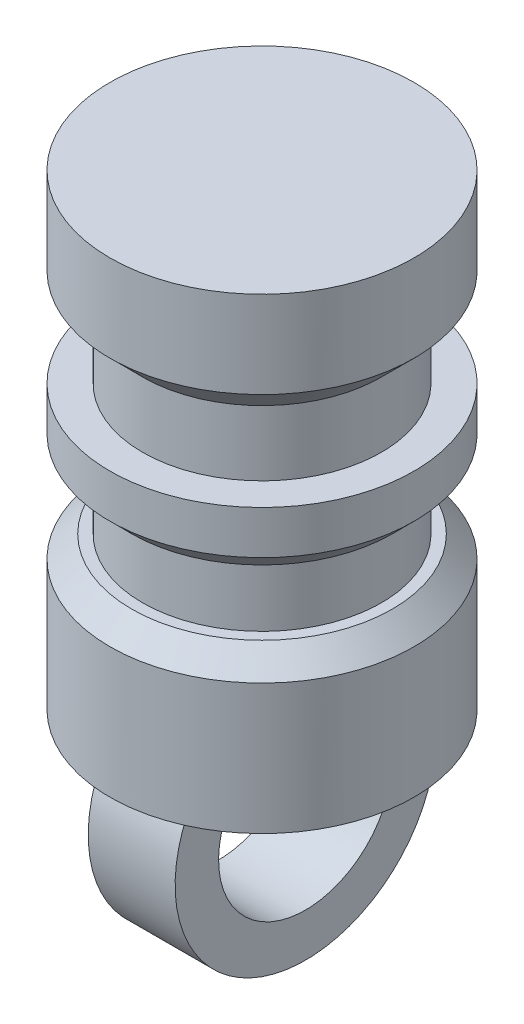
ISO-10303-21;
HEADER;
FILE_DESCRIPTION(('STEP AP214'),'2;1');
FILE_NAME('part.step','',(''),(''),'','','');
FILE_SCHEMA(('AUTOMOTIVE_DESIGN { 1 0 10303 214 1 1 1 1 }'));
ENDSEC;
DATA;
#1=APPLICATION_CONTEXT('core data for automotive mechanical design processes');
#2=APPLICATION_PROTOCOL_DEFINITION('international standard','automotive_design',2000,#1);
#3=PRODUCT_CONTEXT('',#1,'mechanical');
#4=PRODUCT('Part','Part','',(#3));
#5=PRODUCT_RELATED_PRODUCT_CATEGORY('part','',(#4));
#6=PRODUCT_DEFINITION_FORMATION('','',#4);
#7=PRODUCT_DEFINITION_CONTEXT('part definition',#1,'design');
#8=PRODUCT_DEFINITION('design','',#6,#7);
#9=PRODUCT_DEFINITION_SHAPE('','',#8);
#10=(LENGTH_UNIT() NAMED_UNIT(*) SI_UNIT(.MILLI.,.METRE.));
#11=(NAMED_UNIT(*) PLANE_ANGLE_UNIT() SI_UNIT($,.RADIAN.));
#12=(NAMED_UNIT(*) SI_UNIT($,.STERADIAN.) SOLID_ANGLE_UNIT());
#13=UNCERTAINTY_MEASURE_WITH_UNIT(LENGTH_MEASURE(1.E-05),#10,'distance_accuracy_value','');
#14=(GEOMETRIC_REPRESENTATION_CONTEXT(3) GLOBAL_UNCERTAINTY_ASSIGNED_CONTEXT((#13)) GLOBAL_UNIT_ASSIGNED_CONTEXT((#10,
#11,#12)) REPRESENTATION_CONTEXT('',''));
#15=CARTESIAN_POINT('',(0.,0.,0.));
#16=DIRECTION('',(0.,0.,1.));
#17=DIRECTION('',(1.,0.,0.));
#18=AXIS2_PLACEMENT_3D('',#15,#16,#17);
#19=CARTESIAN_POINT('',(0.,7.,0.));
#20=DIRECTION('',(0.,-1.,0.));
#21=DIRECTION('',(0.,0.,-1.));
#22=AXIS2_PLACEMENT_3D('',#19,#20,#21);
#23=CYLINDRICAL_SURFACE('',#22,7.);
#24=CARTESIAN_POINT('',(0.,11.,0.));
#25=DIRECTION('',(0.,1.,0.));
#26=DIRECTION('',(0.,0.,1.));
#27=AXIS2_PLACEMENT_3D('',#24,#25,#26);
#28=CIRCLE('',#27,7.);
#29=CARTESIAN_POINT('',(0.,11.,7.));
#30=VERTEX_POINT('',#29);
#31=EDGE_CURVE('E138',#30,#30,#28,.F.);
#32=ORIENTED_EDGE('',*,*,#31,.T.);
#33=EDGE_LOOP('',(#32));
#34=FACE_BOUND('',#33,.T.);
#35=CARTESIAN_POINT('',(0.,5.,0.));
#36=DIRECTION('',(0.,-1.,0.));
#37=DIRECTION('',(0.,0.,-1.));
#38=AXIS2_PLACEMENT_3D('',#35,#36,#37);
#39=CIRCLE('',#38,7.);
#40=CARTESIAN_POINT('',(0.,5.,-7.));
#41=VERTEX_POINT('',#40);
#42=EDGE_CURVE('E106',#41,#41,#39,.T.);
#43=ORIENTED_EDGE('',*,*,#42,.F.);
#44=EDGE_LOOP('',(#43));
#45=FACE_BOUND('',#44,.T.);
#46=ADVANCED_FACE('F38',(#34,#45),#23,.T.);
#47=CARTESIAN_POINT('',(0.,12.,-7.));
#48=DIRECTION('',(0.,1.,0.));
#49=DIRECTION('',(0.,0.,1.));
#50=AXIS2_PLACEMENT_3D('',#47,#48,#49);
#51=PLANE('',#50);
#52=CARTESIAN_POINT('',(0.,12.,0.));
#53=DIRECTION('',(0.,1.,0.));
#54=DIRECTION('',(0.,0.,1.));
#55=AXIS2_PLACEMENT_3D('',#52,#53,#54);
#56=CIRCLE('',#55,5.99999999999998);
#57=CARTESIAN_POINT('',(0.,12.,5.99999999999998));
#58=VERTEX_POINT('',#57);
#59=EDGE_CURVE('E141',#58,#58,#56,.T.);
#60=ORIENTED_EDGE('',*,*,#59,.T.);
#61=EDGE_LOOP('',(#60));
#62=FACE_BOUND('',#61,.T.);
#63=CARTESIAN_POINT('',(0.,12.,0.));
#64=DIRECTION('',(0.,-1.,0.));
#65=DIRECTION('',(0.,0.,-1.));
#66=AXIS2_PLACEMENT_3D('',#63,#64,#65);
#67=CIRCLE('',#66,5.5);
#68=CARTESIAN_POINT('',(0.,12.,-5.5));
#69=VERTEX_POINT('',#68);
#70=EDGE_CURVE('E135',#69,#69,#67,.T.);
#71=ORIENTED_EDGE('',*,*,#70,.T.);
#72=EDGE_LOOP('',(#71));
#73=FACE_BOUND('',#72,.T.);
#74=ADVANCED_FACE('F163',(#62,#73),#51,.T.);
#75=CARTESIAN_POINT('',(0.,7.,0.));
#76=DIRECTION('',(0.,-1.,0.));
#77=DIRECTION('',(0.,0.,-1.));
#78=AXIS2_PLACEMENT_3D('',#75,#76,#77);
#79=CYLINDRICAL_SURFACE('',#78,5.5);
#80=CARTESIAN_POINT('',(0.,15.,0.));
#81=DIRECTION('',(0.,-1.,0.));
#82=DIRECTION('',(0.,0.,-1.));
#83=AXIS2_PLACEMENT_3D('',#80,#81,#82);
#84=CIRCLE('',#83,5.5);
#85=CARTESIAN_POINT('',(0.,15.,-5.5));
#86=VERTEX_POINT('',#85);
#87=EDGE_CURVE('E132',#86,#86,#84,.T.);
#88=ORIENTED_EDGE('',*,*,#87,.T.);
#89=EDGE_LOOP('',(#88));
#90=FACE_BOUND('',#89,.T.);
#91=ORIENTED_EDGE('',*,*,#70,.F.);
#92=EDGE_LOOP('',(#91));
#93=FACE_BOUND('',#92,.T.);
#94=ADVANCED_FACE('F169',(#90,#93),#79,.T.);
#95=CARTESIAN_POINT('',(0.,15.,-5.5));
#96=DIRECTION('',(0.,-1.,0.));
#97=DIRECTION('',(0.,0.,-1.));
#98=AXIS2_PLACEMENT_3D('',#95,#96,#97);
#99=PLANE('',#98);
#100=CARTESIAN_POINT('',(0.,15.,0.));
#101=DIRECTION('',(0.,-1.,0.));
#102=DIRECTION('',(0.,0.,-1.));
#103=AXIS2_PLACEMENT_3D('',#100,#101,#102);
#104=CIRCLE('',#103,6.00000000000001);
#105=CARTESIAN_POINT('',(0.,15.,-6.00000000000001));
#106=VERTEX_POINT('',#105);
#107=EDGE_CURVE('E48',#106,#106,#104,.T.);
#108=ORIENTED_EDGE('',*,*,#107,.T.);
#109=EDGE_LOOP('',(#108));
#110=FACE_BOUND('',#109,.T.);
#111=ORIENTED_EDGE('',*,*,#87,.F.);
#112=EDGE_LOOP('',(#111));
#113=FACE_BOUND('',#112,.T.);
#114=ADVANCED_FACE('F146',(#110,#113),#99,.T.);
#115=CARTESIAN_POINT('',(0.,7.,0.));
#116=DIRECTION('',(0.,-1.,0.));
#117=DIRECTION('',(0.,0.,-1.));
#118=AXIS2_PLACEMENT_3D('',#115,#116,#117);
#119=CYLINDRICAL_SURFACE('',#118,7.);
#120=CARTESIAN_POINT('',(0.,16.,0.));
#121=DIRECTION('',(0.,-1.,0.));
#122=DIRECTION('',(0.,0.,-1.));
#123=AXIS2_PLACEMENT_3D('',#120,#121,#122);
#124=CIRCLE('',#123,7.);
#125=CARTESIAN_POINT('',(0.,16.,-7.));
#126=VERTEX_POINT('',#125);
#127=EDGE_CURVE('E11',#126,#126,#124,.F.);
#128=ORIENTED_EDGE('',*,*,#127,.T.);
#129=EDGE_LOOP('',(#128));
#130=FACE_BOUND('',#129,.T.);
#131=CARTESIAN_POINT('',(0.,18.,0.));
#132=DIRECTION('',(0.,-1.,0.));
#133=DIRECTION('',(0.,0.,-1.));
#134=AXIS2_PLACEMENT_3D('',#131,#132,#133);
#135=CIRCLE('',#134,7.);
#136=CARTESIAN_POINT('',(0.,18.,-7.));
#137=VERTEX_POINT('',#136);
#138=EDGE_CURVE('E129',#137,#137,#135,.T.);
#139=ORIENTED_EDGE('',*,*,#138,.T.);
#140=EDGE_LOOP('',(#139));
#141=FACE_BOUND('',#140,.T.);
#142=ADVANCED_FACE('F216',(#130,#141),#119,.T.);
#143=CARTESIAN_POINT('',(0.,18.,-7.));
#144=DIRECTION('',(0.,1.,0.));
#145=DIRECTION('',(0.,0.,1.));
#146=AXIS2_PLACEMENT_3D('',#143,#144,#145);
#147=PLANE('',#146);
#148=CARTESIAN_POINT('',(0.,18.,0.));
#149=DIRECTION('',(0.,-1.,0.));
#150=DIRECTION('',(0.,0.,-1.));
#151=AXIS2_PLACEMENT_3D('',#148,#149,#150);
#152=CIRCLE('',#151,5.5);
#153=CARTESIAN_POINT('',(0.,18.,-5.5));
#154=VERTEX_POINT('',#153);
#155=EDGE_CURVE('E126',#154,#154,#152,.T.);
#156=ORIENTED_EDGE('',*,*,#155,.T.);
#157=EDGE_LOOP('',(#156));
#158=FACE_BOUND('',#157,.T.);
#159=ORIENTED_EDGE('',*,*,#138,.F.);
#160=EDGE_LOOP('',(#159));
#161=FACE_BOUND('',#160,.T.);
#162=ADVANCED_FACE('F212',(#158,#161),#147,.T.);
#163=CARTESIAN_POINT('',(0.,7.,0.));
#164=DIRECTION('',(0.,-1.,0.));
#165=DIRECTION('',(0.,0.,-1.));
#166=AXIS2_PLACEMENT_3D('',#163,#164,#165);
#167=CYLINDRICAL_SURFACE('',#166,5.5);
#168=CARTESIAN_POINT('',(0.,21.,0.));
#169=DIRECTION('',(0.,-1.,0.));
#170=DIRECTION('',(0.,0.,-1.));
#171=AXIS2_PLACEMENT_3D('',#168,#169,#170);
#172=CIRCLE('',#171,5.5);
#173=CARTESIAN_POINT('',(0.,21.,-5.5));
#174=VERTEX_POINT('',#173);
#175=EDGE_CURVE('E123',#174,#174,#172,.T.);
#176=ORIENTED_EDGE('',*,*,#175,.T.);
#177=EDGE_LOOP('',(#176));
#178=FACE_BOUND('',#177,.T.);
#179=ORIENTED_EDGE('',*,*,#155,.F.);
#180=EDGE_LOOP('',(#179));
#181=FACE_BOUND('',#180,.T.);
#182=ADVANCED_FACE('F208',(#178,#181),#167,.T.);
#183=CARTESIAN_POINT('',(0.,21.,0.));
#184=DIRECTION('',(0.,1.,0.));
#185=DIRECTION('',(0.,0.,1.));
#186=AXIS2_PLACEMENT_3D('',#183,#184,#185);
#187=CONICAL_SURFACE('',#186,5.5,0.785398163397447);
#188=CARTESIAN_POINT('',(0.,22.5,0.));
#189=DIRECTION('',(0.,-1.,0.));
#190=DIRECTION('',(0.,0.,-1.));
#191=AXIS2_PLACEMENT_3D('',#188,#189,#190);
#192=CIRCLE('',#191,7.);
#193=CARTESIAN_POINT('',(0.,22.5,-7.));
#194=VERTEX_POINT('',#193);
#195=EDGE_CURVE('E120',#194,#194,#192,.T.);
#196=ORIENTED_EDGE('',*,*,#195,.T.);
#197=EDGE_LOOP('',(#196));
#198=FACE_BOUND('',#197,.T.);
#199=ORIENTED_EDGE('',*,*,#175,.F.);
#200=EDGE_LOOP('',(#199));
#201=FACE_BOUND('',#200,.T.);
#202=ADVANCED_FACE('F204',(#198,#201),#187,.T.);
#203=CARTESIAN_POINT('',(0.,7.,0.));
#204=DIRECTION('',(0.,-1.,0.));
#205=DIRECTION('',(0.,0.,-1.));
#206=AXIS2_PLACEMENT_3D('',#203,#204,#205);
#207=CYLINDRICAL_SURFACE('',#206,7.);
#208=ORIENTED_EDGE('',*,*,#195,.F.);
#209=EDGE_LOOP('',(#208));
#210=FACE_BOUND('',#209,.T.);
#211=CARTESIAN_POINT('',(0.,26.5,0.));
#212=DIRECTION('',(0.,1.,0.));
#213=DIRECTION('',(0.,0.,1.));
#214=AXIS2_PLACEMENT_3D('',#211,#212,#213);
#215=CIRCLE('',#214,7.);
#216=CARTESIAN_POINT('',(0.,26.5,7.));
#217=VERTEX_POINT('',#216);
#218=EDGE_CURVE('E103',#217,#217,#215,.T.);
#219=ORIENTED_EDGE('',*,*,#218,.F.);
#220=EDGE_LOOP('',(#219));
#221=FACE_BOUND('',#220,.T.);
#222=ADVANCED_FACE('F159',(#210,#221),#207,.T.);
#223=CARTESIAN_POINT('',(0.,11.,0.));
#224=DIRECTION('',(0.,-1.,0.));
#225=DIRECTION('',(0.,0.,-1.));
#226=AXIS2_PLACEMENT_3D('',#223,#224,#225);
#227=CONICAL_SURFACE('',#226,7.,0.78539816339745);
#228=ORIENTED_EDGE('',*,*,#59,.F.);
#229=EDGE_LOOP('',(#228));
#230=FACE_BOUND('',#229,.T.);
#231=ORIENTED_EDGE('',*,*,#31,.F.);
#232=EDGE_LOOP('',(#231));
#233=FACE_BOUND('',#232,.T.);
#234=ADVANCED_FACE('F150',(#230,#233),#227,.T.);
#235=CARTESIAN_POINT('',(0.,15.,0.));
#236=DIRECTION('',(0.,1.,0.));
#237=DIRECTION('',(0.,0.,1.));
#238=AXIS2_PLACEMENT_3D('',#235,#236,#237);
#239=CONICAL_SURFACE('',#238,6.00000000000001,0.785398163397444);
#240=ORIENTED_EDGE('',*,*,#127,.F.);
#241=EDGE_LOOP('',(#240));
#242=FACE_BOUND('',#241,.T.);
#243=ORIENTED_EDGE('',*,*,#107,.F.);
#244=EDGE_LOOP('',(#243));
#245=FACE_BOUND('',#244,.T.);
#246=ADVANCED_FACE('F41',(#242,#245),#239,.T.);
#247=CARTESIAN_POINT('',(0.,5.,0.));
#248=DIRECTION('',(0.,-1.,0.));
#249=DIRECTION('',(0.,0.,-1.));
#250=AXIS2_PLACEMENT_3D('',#247,#248,#249);
#251=PLANE('',#250);
#252=DIRECTION('',(0.,0.,-1.));
#253=VECTOR('',#252,1.);
#254=CARTESIAN_POINT('',(2.,5.,0.));
#255=LINE('',#254,#253);
#256=CARTESIAN_POINT('',(2.,5.,-2.64575131106459));
#257=VERTEX_POINT('',#256);
#258=CARTESIAN_POINT('',(2.,5.,-5.19615242270663));
#259=VERTEX_POINT('',#258);
#260=EDGE_CURVE('E89',#257,#259,#255,.T.);
#261=ORIENTED_EDGE('',*,*,#260,.T.);
#262=DIRECTION('',(-1.,0.,0.));
#263=VECTOR('',#262,1.);
#264=CARTESIAN_POINT('',(2.,5.,-5.19615242270663));
#265=LINE('',#264,#263);
#266=CARTESIAN_POINT('',(-2.,5.,-5.19615242270663));
#267=VERTEX_POINT('',#266);
#268=EDGE_CURVE('E86',#259,#267,#265,.T.);
#269=ORIENTED_EDGE('',*,*,#268,.T.);
#270=DIRECTION('',(0.,0.,-1.));
#271=VECTOR('',#270,1.);
#272=CARTESIAN_POINT('',(-2.,5.,0.));
#273=LINE('',#272,#271);
#274=CARTESIAN_POINT('',(-2.,5.,-2.64575131106459));
#275=VERTEX_POINT('',#274);
#276=EDGE_CURVE('E344',#275,#267,#273,.T.);
#277=ORIENTED_EDGE('',*,*,#276,.F.);
#278=DIRECTION('',(-1.,0.,0.));
#279=VECTOR('',#278,1.);
#280=CARTESIAN_POINT('',(2.,5.,-2.64575131106459));
#281=LINE('',#280,#279);
#282=EDGE_CURVE('E108',#257,#275,#281,.T.);
#283=ORIENTED_EDGE('',*,*,#282,.F.);
#284=EDGE_LOOP('',(#261,#269,#277,#283));
#285=FACE_BOUND('',#284,.T.);
#286=DIRECTION('',(0.,0.,-1.));
#287=VECTOR('',#286,1.);
#288=CARTESIAN_POINT('',(2.,5.,0.));
#289=LINE('',#288,#287);
#290=CARTESIAN_POINT('',(2.,5.,5.19615242270663));
#291=VERTEX_POINT('',#290);
#292=CARTESIAN_POINT('',(2.,5.,2.64575131106459));
#293=VERTEX_POINT('',#292);
#294=EDGE_CURVE('E90',#291,#293,#289,.T.);
#295=ORIENTED_EDGE('',*,*,#294,.T.);
#296=DIRECTION('',(-1.,0.,0.));
#297=VECTOR('',#296,1.);
#298=CARTESIAN_POINT('',(2.,5.,2.64575131106459));
#299=LINE('',#298,#297);
#300=CARTESIAN_POINT('',(-2.,5.,2.64575131106459));
#301=VERTEX_POINT('',#300);
#302=EDGE_CURVE('E341',#293,#301,#299,.T.);
#303=ORIENTED_EDGE('',*,*,#302,.T.);
#304=DIRECTION('',(0.,0.,-1.));
#305=VECTOR('',#304,1.);
#306=CARTESIAN_POINT('',(-2.,5.,0.));
#307=LINE('',#306,#305);
#308=CARTESIAN_POINT('',(-2.,5.,5.19615242270663));
#309=VERTEX_POINT('',#308);
#310=EDGE_CURVE('E102',#309,#301,#307,.T.);
#311=ORIENTED_EDGE('',*,*,#310,.F.);
#312=DIRECTION('',(-1.,0.,0.));
#313=VECTOR('',#312,1.);
#314=CARTESIAN_POINT('',(2.,5.,5.19615242270663));
#315=LINE('',#314,#313);
#316=EDGE_CURVE('E83',#291,#309,#315,.T.);
#317=ORIENTED_EDGE('',*,*,#316,.F.);
#318=EDGE_LOOP('',(#295,#303,#311,#317));
#319=FACE_BOUND('',#318,.T.);
#320=ORIENTED_EDGE('',*,*,#42,.T.);
#321=EDGE_LOOP('',(#320));
#322=FACE_BOUND('',#321,.T.);
#323=ADVANCED_FACE('F100',(#285,#319,#322),#251,.T.);
#324=CARTESIAN_POINT('',(0.,26.5,0.));
#325=DIRECTION('',(0.,1.,0.));
#326=DIRECTION('',(0.,0.,1.));
#327=AXIS2_PLACEMENT_3D('',#324,#325,#326);
#328=PLANE('',#327);
#329=ORIENTED_EDGE('',*,*,#218,.T.);
#330=EDGE_LOOP('',(#329));
#331=FACE_BOUND('',#330,.T.);
#332=ADVANCED_FACE('F156',(#331),#328,.T.);
#333=CARTESIAN_POINT('',(2.,2.,0.));
#334=DIRECTION('',(-1.,0.,0.));
#335=DIRECTION('',(0.,0.,1.));
#336=AXIS2_PLACEMENT_3D('',#333,#334,#335);
#337=CYLINDRICAL_SURFACE('',#336,6.);
#338=CARTESIAN_POINT('',(-2.,2.,0.));
#339=DIRECTION('',(1.,0.,0.));
#340=DIRECTION('',(0.,0.,-1.));
#341=AXIS2_PLACEMENT_3D('',#338,#339,#340);
#342=CIRCLE('',#341,6.);
#343=EDGE_CURVE('E60',#309,#267,#342,.T.);
#344=ORIENTED_EDGE('',*,*,#343,.T.);
#345=ORIENTED_EDGE('',*,*,#268,.F.);
#346=CARTESIAN_POINT('',(2.,2.,0.));
#347=DIRECTION('',(1.,0.,0.));
#348=DIRECTION('',(0.,0.,-1.));
#349=AXIS2_PLACEMENT_3D('',#346,#347,#348);
#350=CIRCLE('',#349,6.);
#351=EDGE_CURVE('E79',#291,#259,#350,.T.);
#352=ORIENTED_EDGE('',*,*,#351,.F.);
#353=ORIENTED_EDGE('',*,*,#316,.T.);
#354=EDGE_LOOP('',(#344,#345,#352,#353));
#355=FACE_BOUND('',#354,.T.);
#356=ADVANCED_FACE('F81',(#355),#337,.T.);
#357=CARTESIAN_POINT('',(2.,2.,0.));
#358=DIRECTION('',(-1.,0.,0.));
#359=DIRECTION('',(0.,0.,1.));
#360=AXIS2_PLACEMENT_3D('',#357,#358,#359);
#361=CYLINDRICAL_SURFACE('',#360,4.);
#362=CARTESIAN_POINT('',(-2.,2.,0.));
#363=DIRECTION('',(1.,0.,0.));
#364=DIRECTION('',(0.,0.,-1.));
#365=AXIS2_PLACEMENT_3D('',#362,#363,#364);
#366=CIRCLE('',#365,4.);
#367=EDGE_CURVE('E55',#301,#275,#366,.T.);
#368=ORIENTED_EDGE('',*,*,#367,.F.);
#369=ORIENTED_EDGE('',*,*,#302,.F.);
#370=CARTESIAN_POINT('',(2.,2.,0.));
#371=DIRECTION('',(1.,0.,0.));
#372=DIRECTION('',(0.,0.,-1.));
#373=AXIS2_PLACEMENT_3D('',#370,#371,#372);
#374=CIRCLE('',#373,4.);
#375=EDGE_CURVE('E96',#293,#257,#374,.T.);
#376=ORIENTED_EDGE('',*,*,#375,.T.);
#377=ORIENTED_EDGE('',*,*,#282,.T.);
#378=EDGE_LOOP('',(#368,#369,#376,#377));
#379=FACE_BOUND('',#378,.T.);
#380=ADVANCED_FACE('F311',(#379),#361,.F.);
#381=CARTESIAN_POINT('',(2.,0.,0.));
#382=DIRECTION('',(1.,0.,0.));
#383=DIRECTION('',(0.,0.,-1.));
#384=AXIS2_PLACEMENT_3D('',#381,#382,#383);
#385=PLANE('',#384);
#386=ORIENTED_EDGE('',*,*,#294,.F.);
#387=ORIENTED_EDGE('',*,*,#351,.T.);
#388=ORIENTED_EDGE('',*,*,#260,.F.);
#389=ORIENTED_EDGE('',*,*,#375,.F.);
#390=EDGE_LOOP('',(#386,#387,#388,#389));
#391=FACE_BOUND('',#390,.T.);
#392=ADVANCED_FACE('F94',(#391),#385,.T.);
#393=CARTESIAN_POINT('',(-2.,0.,0.));
#394=DIRECTION('',(1.,0.,0.));
#395=DIRECTION('',(0.,0.,-1.));
#396=AXIS2_PLACEMENT_3D('',#393,#394,#395);
#397=PLANE('',#396);
#398=ORIENTED_EDGE('',*,*,#310,.T.);
#399=ORIENTED_EDGE('',*,*,#367,.T.);
#400=ORIENTED_EDGE('',*,*,#276,.T.);
#401=ORIENTED_EDGE('',*,*,#343,.F.);
#402=EDGE_LOOP('',(#398,#399,#400,#401));
#403=FACE_BOUND('',#402,.T.);
#404=ADVANCED_FACE('F326',(#403),#397,.F.);
#405=CLOSED_SHELL('',(#46,#74,#94,#114,#142,#162,#182,#202,#222,#234,#246,#323,#332,#356,#380,
#392,#404));
#406=CARTESIAN_POINT('',(0.,24.5,0.));
#407=DIRECTION('',(0.,1.,0.));
#408=DIRECTION('',(0.,0.,1.));
#409=AXIS2_PLACEMENT_3D('',#406,#407,#408);
#410=PLANE('',#409);
#411=CARTESIAN_POINT('',(0.,24.5,0.));
#412=DIRECTION('',(0.,-1.,0.));
#413=DIRECTION('',(0.,0.,-1.));
#414=AXIS2_PLACEMENT_3D('',#411,#412,#413);
#415=CIRCLE('',#414,4.);
#416=CARTESIAN_POINT('',(0.,24.5,-4.));
#417=VERTEX_POINT('',#416);
#418=EDGE_CURVE('E117',#417,#417,#415,.T.);
#419=ORIENTED_EDGE('',*,*,#418,.T.);
#420=EDGE_LOOP('',(#419));
#421=FACE_BOUND('',#420,.T.);
#422=ADVANCED_FACE('F188',(#421),#410,.F.);
#423=CARTESIAN_POINT('',(0.,7.,0.));
#424=DIRECTION('',(0.,-1.,0.));
#425=DIRECTION('',(0.,0.,-1.));
#426=AXIS2_PLACEMENT_3D('',#423,#424,#425);
#427=PLANE('',#426);
#428=CARTESIAN_POINT('',(0.,7.,0.));
#429=DIRECTION('',(0.,1.,0.));
#430=DIRECTION('',(0.,0.,1.));
#431=AXIS2_PLACEMENT_3D('',#428,#429,#430);
#432=CIRCLE('',#431,4.);
#433=CARTESIAN_POINT('',(0.,7.,4.));
#434=VERTEX_POINT('',#433);
#435=EDGE_CURVE('E114',#434,#434,#432,.T.);
#436=ORIENTED_EDGE('',*,*,#435,.T.);
#437=EDGE_LOOP('',(#436));
#438=FACE_BOUND('',#437,.T.);
#439=ADVANCED_FACE('F177',(#438),#427,.F.);
#440=CARTESIAN_POINT('',(0.,7.,0.));
#441=DIRECTION('',(0.,-1.,0.));
#442=DIRECTION('',(0.,0.,-1.));
#443=AXIS2_PLACEMENT_3D('',#440,#441,#442);
#444=CYLINDRICAL_SURFACE('',#443,4.);
#445=ORIENTED_EDGE('',*,*,#435,.F.);
#446=EDGE_LOOP('',(#445));
#447=FACE_BOUND('',#446,.T.);
#448=ORIENTED_EDGE('',*,*,#418,.F.);
#449=EDGE_LOOP('',(#448));
#450=FACE_BOUND('',#449,.T.);
#451=ADVANCED_FACE('F175',(#447,#450),#444,.F.);
#452=CLOSED_SHELL('',(#422,#439,#451));
#453=ORIENTED_CLOSED_SHELL('',*,#452,.T.);
#454=BREP_WITH_VOIDS('B2',#405,(#453));
#455=ADVANCED_BREP_SHAPE_REPRESENTATION('',(#18,#454),#14);
#456=SHAPE_DEFINITION_REPRESENTATION(#9,#455);
ENDSEC;
END-ISO-10303-21;
